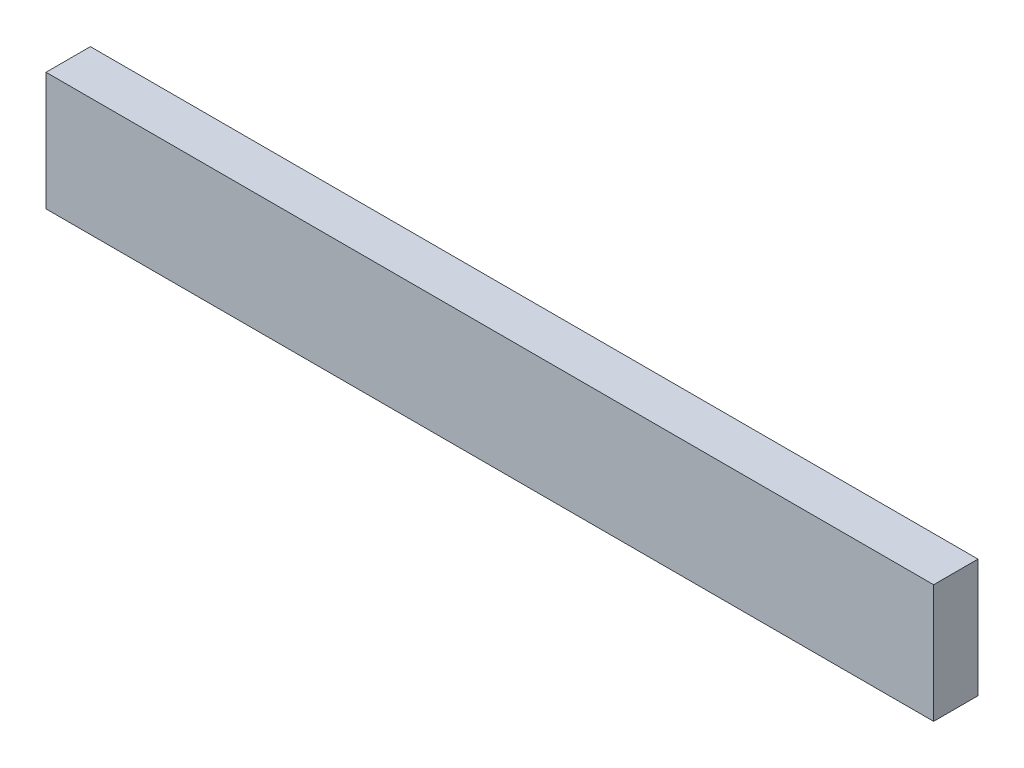
ISO-10303-21;
HEADER;
FILE_DESCRIPTION(('STEP AP214'),'2;1');
FILE_NAME('part.step','',(''),(''),'','','');
FILE_SCHEMA(('AUTOMOTIVE_DESIGN { 1 0 10303 214 1 1 1 1 }'));
ENDSEC;
DATA;
#1=APPLICATION_CONTEXT('core data for automotive mechanical design processes');
#2=APPLICATION_PROTOCOL_DEFINITION('international standard','automotive_design',2000,#1);
#3=PRODUCT_CONTEXT('',#1,'mechanical');
#4=PRODUCT('Part','Part','',(#3));
#5=PRODUCT_RELATED_PRODUCT_CATEGORY('part','',(#4));
#6=PRODUCT_DEFINITION_FORMATION('','',#4);
#7=PRODUCT_DEFINITION_CONTEXT('part definition',#1,'design');
#8=PRODUCT_DEFINITION('design','',#6,#7);
#9=PRODUCT_DEFINITION_SHAPE('','',#8);
#10=(LENGTH_UNIT() NAMED_UNIT(*) SI_UNIT(.MILLI.,.METRE.));
#11=(NAMED_UNIT(*) PLANE_ANGLE_UNIT() SI_UNIT($,.RADIAN.));
#12=(NAMED_UNIT(*) SI_UNIT($,.STERADIAN.) SOLID_ANGLE_UNIT());
#13=UNCERTAINTY_MEASURE_WITH_UNIT(LENGTH_MEASURE(1.E-05),#10,'distance_accuracy_value','');
#14=(GEOMETRIC_REPRESENTATION_CONTEXT(3) GLOBAL_UNCERTAINTY_ASSIGNED_CONTEXT((#13)) GLOBAL_UNIT_ASSIGNED_CONTEXT((#10,
#11,#12)) REPRESENTATION_CONTEXT('',''));
#15=CARTESIAN_POINT('',(0.,0.,0.));
#16=DIRECTION('',(0.,0.,1.));
#17=DIRECTION('',(1.,0.,0.));
#18=AXIS2_PLACEMENT_3D('',#15,#16,#17);
#19=CARTESIAN_POINT('',(0.,0.,3.));
#20=DIRECTION('',(1.,0.,0.));
#21=DIRECTION('',(0.,0.,-1.));
#22=AXIS2_PLACEMENT_3D('',#19,#20,#21);
#23=PLANE('',#22);
#24=DIRECTION('',(0.,-1.,0.));
#25=VECTOR('',#24,1.);
#26=CARTESIAN_POINT('',(0.,0.,0.));
#27=LINE('',#26,#25);
#28=CARTESIAN_POINT('',(0.,8.,0.));
#29=VERTEX_POINT('',#28);
#30=CARTESIAN_POINT('',(0.,0.,0.));
#31=VERTEX_POINT('',#30);
#32=EDGE_CURVE('E95',#29,#31,#27,.T.);
#33=ORIENTED_EDGE('',*,*,#32,.T.);
#34=DIRECTION('',(0.,0.,-1.));
#35=VECTOR('',#34,1.);
#36=CARTESIAN_POINT('',(0.,0.,3.));
#37=LINE('',#36,#35);
#38=CARTESIAN_POINT('',(0.,0.,3.));
#39=VERTEX_POINT('',#38);
#40=EDGE_CURVE('E11',#39,#31,#37,.T.);
#41=ORIENTED_EDGE('',*,*,#40,.F.);
#42=DIRECTION('',(0.,-1.,0.));
#43=VECTOR('',#42,1.);
#44=CARTESIAN_POINT('',(0.,0.,3.));
#45=LINE('',#44,#43);
#46=CARTESIAN_POINT('',(0.,8.,3.));
#47=VERTEX_POINT('',#46);
#48=EDGE_CURVE('E83',#47,#39,#45,.T.);
#49=ORIENTED_EDGE('',*,*,#48,.F.);
#50=DIRECTION('',(0.,0.,-1.));
#51=VECTOR('',#50,1.);
#52=CARTESIAN_POINT('',(0.,8.,3.));
#53=LINE('',#52,#51);
#54=EDGE_CURVE('E91',#47,#29,#53,.T.);
#55=ORIENTED_EDGE('',*,*,#54,.T.);
#56=EDGE_LOOP('',(#33,#41,#49,#55));
#57=FACE_BOUND('',#56,.T.);
#58=ADVANCED_FACE('F32',(#57),#23,.F.);
#59=CARTESIAN_POINT('',(0.,0.,3.));
#60=DIRECTION('',(0.,1.,0.));
#61=DIRECTION('',(0.,0.,1.));
#62=AXIS2_PLACEMENT_3D('',#59,#60,#61);
#63=PLANE('',#62);
#64=DIRECTION('',(1.,0.,0.));
#65=VECTOR('',#64,1.);
#66=CARTESIAN_POINT('',(0.,0.,0.));
#67=LINE('',#66,#65);
#68=CARTESIAN_POINT('',(60.,0.,0.));
#69=VERTEX_POINT('',#68);
#70=EDGE_CURVE('E87',#31,#69,#67,.T.);
#71=ORIENTED_EDGE('',*,*,#70,.T.);
#72=DIRECTION('',(0.,0.,-1.));
#73=VECTOR('',#72,1.);
#74=CARTESIAN_POINT('',(60.,0.,3.));
#75=LINE('',#74,#73);
#76=CARTESIAN_POINT('',(60.,0.,3.));
#77=VERTEX_POINT('',#76);
#78=EDGE_CURVE('E40',#77,#69,#75,.T.);
#79=ORIENTED_EDGE('',*,*,#78,.F.);
#80=DIRECTION('',(1.,0.,0.));
#81=VECTOR('',#80,1.);
#82=CARTESIAN_POINT('',(0.,0.,3.));
#83=LINE('',#82,#81);
#84=EDGE_CURVE('E78',#39,#77,#83,.T.);
#85=ORIENTED_EDGE('',*,*,#84,.F.);
#86=ORIENTED_EDGE('',*,*,#40,.T.);
#87=EDGE_LOOP('',(#71,#79,#85,#86));
#88=FACE_BOUND('',#87,.T.);
#89=ADVANCED_FACE('F86',(#88),#63,.F.);
#90=CARTESIAN_POINT('',(60.,0.,3.));
#91=DIRECTION('',(-1.,0.,0.));
#92=DIRECTION('',(0.,0.,1.));
#93=AXIS2_PLACEMENT_3D('',#90,#91,#92);
#94=PLANE('',#93);
#95=DIRECTION('',(0.,1.,0.));
#96=VECTOR('',#95,1.);
#97=CARTESIAN_POINT('',(60.,0.,0.));
#98=LINE('',#97,#96);
#99=CARTESIAN_POINT('',(60.,8.,0.));
#100=VERTEX_POINT('',#99);
#101=EDGE_CURVE('E65',#69,#100,#98,.T.);
#102=ORIENTED_EDGE('',*,*,#101,.T.);
#103=DIRECTION('',(0.,0.,-1.));
#104=VECTOR('',#103,1.);
#105=CARTESIAN_POINT('',(60.,8.,3.));
#106=LINE('',#105,#104);
#107=CARTESIAN_POINT('',(60.,8.,3.));
#108=VERTEX_POINT('',#107);
#109=EDGE_CURVE('E88',#108,#100,#106,.T.);
#110=ORIENTED_EDGE('',*,*,#109,.F.);
#111=DIRECTION('',(0.,1.,0.));
#112=VECTOR('',#111,1.);
#113=CARTESIAN_POINT('',(60.,0.,3.));
#114=LINE('',#113,#112);
#115=EDGE_CURVE('E81',#77,#108,#114,.T.);
#116=ORIENTED_EDGE('',*,*,#115,.F.);
#117=ORIENTED_EDGE('',*,*,#78,.T.);
#118=EDGE_LOOP('',(#102,#110,#116,#117));
#119=FACE_BOUND('',#118,.T.);
#120=ADVANCED_FACE('F89',(#119),#94,.F.);
#121=CARTESIAN_POINT('',(0.,8.,3.));
#122=DIRECTION('',(0.,-1.,0.));
#123=DIRECTION('',(0.,0.,-1.));
#124=AXIS2_PLACEMENT_3D('',#121,#122,#123);
#125=PLANE('',#124);
#126=DIRECTION('',(-1.,0.,0.));
#127=VECTOR('',#126,1.);
#128=CARTESIAN_POINT('',(0.,8.,0.));
#129=LINE('',#128,#127);
#130=EDGE_CURVE('E71',#100,#29,#129,.T.);
#131=ORIENTED_EDGE('',*,*,#130,.T.);
#132=ORIENTED_EDGE('',*,*,#54,.F.);
#133=DIRECTION('',(-1.,0.,0.));
#134=VECTOR('',#133,1.);
#135=CARTESIAN_POINT('',(0.,8.,3.));
#136=LINE('',#135,#134);
#137=EDGE_CURVE('E48',#108,#47,#136,.T.);
#138=ORIENTED_EDGE('',*,*,#137,.F.);
#139=ORIENTED_EDGE('',*,*,#109,.T.);
#140=EDGE_LOOP('',(#131,#132,#138,#139));
#141=FACE_BOUND('',#140,.T.);
#142=ADVANCED_FACE('F102',(#141),#125,.F.);
#143=CARTESIAN_POINT('',(0.,0.,3.));
#144=DIRECTION('',(0.,0.,-1.));
#145=DIRECTION('',(-1.,0.,0.));
#146=AXIS2_PLACEMENT_3D('',#143,#144,#145);
#147=PLANE('',#146);
#148=ORIENTED_EDGE('',*,*,#48,.T.);
#149=ORIENTED_EDGE('',*,*,#84,.T.);
#150=ORIENTED_EDGE('',*,*,#115,.T.);
#151=ORIENTED_EDGE('',*,*,#137,.T.);
#152=EDGE_LOOP('',(#148,#149,#150,#151));
#153=FACE_BOUND('',#152,.T.);
#154=ADVANCED_FACE('F79',(#153),#147,.F.);
#155=CARTESIAN_POINT('',(0.,0.,0.));
#156=DIRECTION('',(0.,0.,-1.));
#157=DIRECTION('',(-1.,0.,0.));
#158=AXIS2_PLACEMENT_3D('',#155,#156,#157);
#159=PLANE('',#158);
#160=ORIENTED_EDGE('',*,*,#32,.F.);
#161=ORIENTED_EDGE('',*,*,#130,.F.);
#162=ORIENTED_EDGE('',*,*,#101,.F.);
#163=ORIENTED_EDGE('',*,*,#70,.F.);
#164=EDGE_LOOP('',(#160,#161,#162,#163));
#165=FACE_BOUND('',#164,.T.);
#166=ADVANCED_FACE('F105',(#165),#159,.T.);
#167=CLOSED_SHELL('',(#58,#89,#120,#142,#154,#166));
#168=MANIFOLD_SOLID_BREP('B2',#167);
#169=ADVANCED_BREP_SHAPE_REPRESENTATION('',(#18,#168),#14);
#170=SHAPE_DEFINITION_REPRESENTATION(#9,#169);
ENDSEC;
END-ISO-10303-21;
